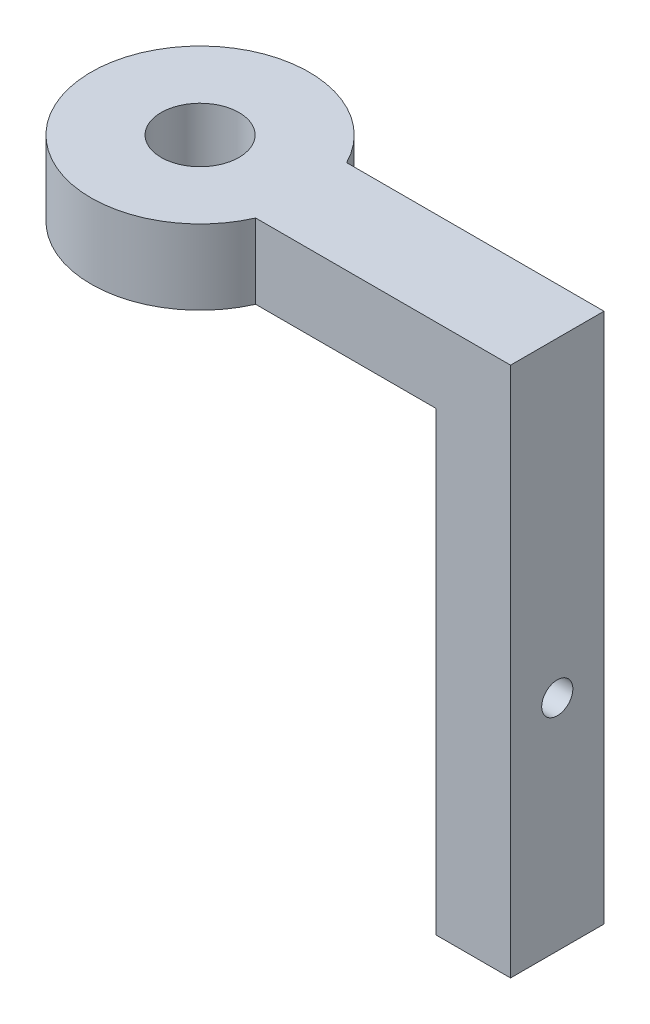
ISO-10303-21;
HEADER;
FILE_DESCRIPTION(('STEP AP214'),'2;1');
FILE_NAME('part.step','',(''),(''),'','','');
FILE_SCHEMA(('AUTOMOTIVE_DESIGN { 1 0 10303 214 1 1 1 1 }'));
ENDSEC;
DATA;
#1=APPLICATION_CONTEXT('core data for automotive mechanical design processes');
#2=APPLICATION_PROTOCOL_DEFINITION('international standard','automotive_design',2000,#1);
#3=PRODUCT_CONTEXT('',#1,'mechanical');
#4=PRODUCT('Part','Part','',(#3));
#5=PRODUCT_RELATED_PRODUCT_CATEGORY('part','',(#4));
#6=PRODUCT_DEFINITION_FORMATION('','',#4);
#7=PRODUCT_DEFINITION_CONTEXT('part definition',#1,'design');
#8=PRODUCT_DEFINITION('design','',#6,#7);
#9=PRODUCT_DEFINITION_SHAPE('','',#8);
#10=(LENGTH_UNIT() NAMED_UNIT(*) SI_UNIT(.MILLI.,.METRE.));
#11=(NAMED_UNIT(*) PLANE_ANGLE_UNIT() SI_UNIT($,.RADIAN.));
#12=(NAMED_UNIT(*) SI_UNIT($,.STERADIAN.) SOLID_ANGLE_UNIT());
#13=UNCERTAINTY_MEASURE_WITH_UNIT(LENGTH_MEASURE(1.E-05),#10,'distance_accuracy_value','');
#14=(GEOMETRIC_REPRESENTATION_CONTEXT(3) GLOBAL_UNCERTAINTY_ASSIGNED_CONTEXT((#13)) GLOBAL_UNIT_ASSIGNED_CONTEXT((#10,
#11,#12)) REPRESENTATION_CONTEXT('',''));
#15=CARTESIAN_POINT('',(0.,0.,0.));
#16=DIRECTION('',(0.,0.,1.));
#17=DIRECTION('',(1.,0.,0.));
#18=AXIS2_PLACEMENT_3D('',#15,#16,#17);
#19=CARTESIAN_POINT('',(-46.1534404276847,37.9375,15.));
#20=DIRECTION('',(0.,1.,0.));
#21=DIRECTION('',(0.,0.,1.));
#22=AXIS2_PLACEMENT_3D('',#19,#20,#21);
#23=PLANE('',#22);
#24=CARTESIAN_POINT('',(-58.0803469959912,37.9375,7.9203315090152));
#25=DIRECTION('',(0.,1.,0.));
#26=DIRECTION('',(0.,0.,1.));
#27=AXIS2_PLACEMENT_3D('',#24,#25,#26);
#28=CIRCLE('',#27,6.25);
#29=CARTESIAN_POINT('',(-58.0803469959912,37.9375,14.1703315090152));
#30=VERTEX_POINT('',#29);
#31=EDGE_CURVE('E112',#30,#30,#28,.T.);
#32=ORIENTED_EDGE('',*,*,#31,.T.);
#33=EDGE_LOOP('',(#32));
#34=FACE_BOUND('',#33,.T.);
#35=DIRECTION('',(1.,0.,0.));
#36=VECTOR('',#35,1.);
#37=CARTESIAN_POINT('',(-46.1534404276847,37.9375,15.));
#38=LINE('',#37,#36);
#39=CARTESIAN_POINT('',(-42.0763383088604,37.9375,15.));
#40=VERTEX_POINT('',#39);
#41=CARTESIAN_POINT('',(-13.1534404276847,37.9375,15.));
#42=VERTEX_POINT('',#41);
#43=EDGE_CURVE('E84',#40,#42,#38,.T.);
#44=ORIENTED_EDGE('',*,*,#43,.F.);
#45=CARTESIAN_POINT('',(-58.0803469959912,37.9375,7.9203315090152));
#46=DIRECTION('',(0.,1.,0.));
#47=DIRECTION('',(0.,0.,1.));
#48=AXIS2_PLACEMENT_3D('',#45,#46,#47);
#49=CIRCLE('',#48,17.5);
#50=CARTESIAN_POINT('',(-42.4752725396709,37.9375,0.));
#51=VERTEX_POINT('',#50);
#52=EDGE_CURVE('E103',#51,#40,#49,.T.);
#53=ORIENTED_EDGE('',*,*,#52,.F.);
#54=DIRECTION('',(1.,0.,0.));
#55=VECTOR('',#54,1.);
#56=CARTESIAN_POINT('',(-46.1534404276847,37.9375,0.));
#57=LINE('',#56,#55);
#58=CARTESIAN_POINT('',(-13.1534404276847,37.9375,0.));
#59=VERTEX_POINT('',#58);
#60=EDGE_CURVE('E104',#51,#59,#57,.T.);
#61=ORIENTED_EDGE('',*,*,#60,.T.);
#62=DIRECTION('',(0.,0.,-1.));
#63=VECTOR('',#62,1.);
#64=CARTESIAN_POINT('',(-13.1534404276847,37.9375,15.));
#65=LINE('',#64,#63);
#66=EDGE_CURVE('E47',#42,#59,#65,.T.);
#67=ORIENTED_EDGE('',*,*,#66,.F.);
#68=EDGE_LOOP('',(#44,#53,#61,#67));
#69=FACE_BOUND('',#68,.T.);
#70=ADVANCED_FACE('F39',(#34,#69),#23,.F.);
#71=CARTESIAN_POINT('',(-13.1534404276847,37.9375,15.));
#72=DIRECTION('',(1.,0.,0.));
#73=DIRECTION('',(0.,1.,0.));
#74=AXIS2_PLACEMENT_3D('',#71,#72,#73);
#75=PLANE('',#74);
#76=CARTESIAN_POINT('',(-13.1534404276847,-0.0625000000000015,7.5));
#77=DIRECTION('',(1.,0.,0.));
#78=DIRECTION('',(0.,1.,0.));
#79=AXIS2_PLACEMENT_3D('',#76,#77,#78);
#80=CIRCLE('',#79,2.5);
#81=CARTESIAN_POINT('',(-13.1534404276847,2.4375,7.5));
#82=VERTEX_POINT('',#81);
#83=EDGE_CURVE('E146',#82,#82,#80,.T.);
#84=ORIENTED_EDGE('',*,*,#83,.T.);
#85=EDGE_LOOP('',(#84));
#86=FACE_BOUND('',#85,.T.);
#87=DIRECTION('',(0.,-1.,0.));
#88=VECTOR('',#87,1.);
#89=CARTESIAN_POINT('',(-13.1534404276847,37.9375,0.));
#90=LINE('',#89,#88);
#91=CARTESIAN_POINT('',(-13.1534404276847,-35.2743804561542,0.));
#92=VERTEX_POINT('',#91);
#93=EDGE_CURVE('E125',#59,#92,#90,.T.);
#94=ORIENTED_EDGE('',*,*,#93,.T.);
#95=DIRECTION('',(0.,0.,-1.));
#96=VECTOR('',#95,1.);
#97=CARTESIAN_POINT('',(-13.1534404276847,-35.2743804561542,15.));
#98=LINE('',#97,#96);
#99=CARTESIAN_POINT('',(-13.1534404276847,-35.2743804561542,15.));
#100=VERTEX_POINT('',#99);
#101=EDGE_CURVE('E191',#100,#92,#98,.T.);
#102=ORIENTED_EDGE('',*,*,#101,.F.);
#103=DIRECTION('',(0.,-1.,0.));
#104=VECTOR('',#103,1.);
#105=CARTESIAN_POINT('',(-13.1534404276847,37.9375,15.));
#106=LINE('',#105,#104);
#107=EDGE_CURVE('E136',#42,#100,#106,.T.);
#108=ORIENTED_EDGE('',*,*,#107,.F.);
#109=ORIENTED_EDGE('',*,*,#66,.T.);
#110=EDGE_LOOP('',(#94,#102,#108,#109));
#111=FACE_BOUND('',#110,.T.);
#112=ADVANCED_FACE('F175',(#86,#111),#75,.F.);
#113=CARTESIAN_POINT('',(-13.1534404276847,-35.2743804561542,15.));
#114=DIRECTION('',(0.,1.,0.));
#115=DIRECTION('',(0.,0.,1.));
#116=AXIS2_PLACEMENT_3D('',#113,#114,#115);
#117=PLANE('',#116);
#118=DIRECTION('',(1.,0.,0.));
#119=VECTOR('',#118,1.);
#120=CARTESIAN_POINT('',(-13.1534404276847,-35.2743804561542,0.));
#121=LINE('',#120,#119);
#122=CARTESIAN_POINT('',(-1.15344042768469,-35.2743804561542,0.));
#123=VERTEX_POINT('',#122);
#124=EDGE_CURVE('E196',#92,#123,#121,.T.);
#125=ORIENTED_EDGE('',*,*,#124,.T.);
#126=DIRECTION('',(0.,0.,-1.));
#127=VECTOR('',#126,1.);
#128=CARTESIAN_POINT('',(-1.15344042768469,-35.2743804561542,15.));
#129=LINE('',#128,#127);
#130=CARTESIAN_POINT('',(-1.15344042768469,-35.2743804561542,15.));
#131=VERTEX_POINT('',#130);
#132=EDGE_CURVE('E117',#131,#123,#129,.T.);
#133=ORIENTED_EDGE('',*,*,#132,.F.);
#134=DIRECTION('',(1.,0.,0.));
#135=VECTOR('',#134,1.);
#136=CARTESIAN_POINT('',(-13.1534404276847,-35.2743804561542,15.));
#137=LINE('',#136,#135);
#138=EDGE_CURVE('E119',#100,#131,#137,.T.);
#139=ORIENTED_EDGE('',*,*,#138,.F.);
#140=ORIENTED_EDGE('',*,*,#101,.T.);
#141=EDGE_LOOP('',(#125,#133,#139,#140));
#142=FACE_BOUND('',#141,.T.);
#143=ADVANCED_FACE('F165',(#142),#117,.F.);
#144=CARTESIAN_POINT('',(-1.15344042768471,49.9375,15.));
#145=DIRECTION('',(-1.,0.,0.));
#146=DIRECTION('',(0.,-1.,0.));
#147=AXIS2_PLACEMENT_3D('',#144,#145,#146);
#148=PLANE('',#147);
#149=CARTESIAN_POINT('',(-1.1534404276847,-0.0625000000000002,7.5));
#150=DIRECTION('',(1.,0.,0.));
#151=DIRECTION('',(0.,1.,0.));
#152=AXIS2_PLACEMENT_3D('',#149,#150,#151);
#153=CIRCLE('',#152,2.5);
#154=CARTESIAN_POINT('',(-1.1534404276847,2.4375,7.5));
#155=VERTEX_POINT('',#154);
#156=EDGE_CURVE('E154',#155,#155,#153,.T.);
#157=ORIENTED_EDGE('',*,*,#156,.F.);
#158=EDGE_LOOP('',(#157));
#159=FACE_BOUND('',#158,.T.);
#160=DIRECTION('',(0.,1.,0.));
#161=VECTOR('',#160,1.);
#162=CARTESIAN_POINT('',(-1.15344042768471,49.9375,0.));
#163=LINE('',#162,#161);
#164=CARTESIAN_POINT('',(-1.15344042768471,49.9375,0.));
#165=VERTEX_POINT('',#164);
#166=EDGE_CURVE('E73',#123,#165,#163,.T.);
#167=ORIENTED_EDGE('',*,*,#166,.T.);
#168=DIRECTION('',(0.,0.,-1.));
#169=VECTOR('',#168,1.);
#170=CARTESIAN_POINT('',(-1.15344042768471,49.9375,15.));
#171=LINE('',#170,#169);
#172=CARTESIAN_POINT('',(-1.15344042768471,49.9375,15.));
#173=VERTEX_POINT('',#172);
#174=EDGE_CURVE('E115',#173,#165,#171,.T.);
#175=ORIENTED_EDGE('',*,*,#174,.F.);
#176=DIRECTION('',(0.,1.,0.));
#177=VECTOR('',#176,1.);
#178=CARTESIAN_POINT('',(-1.1534404276847,37.9375,15.));
#179=LINE('',#178,#177);
#180=EDGE_CURVE('E55',#131,#173,#179,.T.);
#181=ORIENTED_EDGE('',*,*,#180,.F.);
#182=ORIENTED_EDGE('',*,*,#132,.T.);
#183=EDGE_LOOP('',(#167,#175,#181,#182));
#184=FACE_BOUND('',#183,.T.);
#185=ADVANCED_FACE('F163',(#159,#184),#148,.F.);
#186=CARTESIAN_POINT('',(-46.1534404276847,49.9375,15.));
#187=DIRECTION('',(0.,-1.,0.));
#188=DIRECTION('',(0.,0.,-1.));
#189=AXIS2_PLACEMENT_3D('',#186,#187,#188);
#190=PLANE('',#189);
#191=CARTESIAN_POINT('',(-58.0803469959912,49.9375,7.9203315090152));
#192=DIRECTION('',(0.,1.,0.));
#193=DIRECTION('',(0.,0.,1.));
#194=AXIS2_PLACEMENT_3D('',#191,#192,#193);
#195=CIRCLE('',#194,6.25);
#196=CARTESIAN_POINT('',(-58.0803469959912,49.9375,14.1703315090152));
#197=VERTEX_POINT('',#196);
#198=EDGE_CURVE('E145',#197,#197,#195,.T.);
#199=ORIENTED_EDGE('',*,*,#198,.F.);
#200=EDGE_LOOP('',(#199));
#201=FACE_BOUND('',#200,.T.);
#202=DIRECTION('',(-1.,0.,0.));
#203=VECTOR('',#202,1.);
#204=CARTESIAN_POINT('',(-46.1534404276847,49.9375,0.));
#205=LINE('',#204,#203);
#206=CARTESIAN_POINT('',(-42.4752725396709,49.9375,0.));
#207=VERTEX_POINT('',#206);
#208=EDGE_CURVE('E111',#165,#207,#205,.T.);
#209=ORIENTED_EDGE('',*,*,#208,.T.);
#210=CARTESIAN_POINT('',(-58.0803469959912,49.9375,7.9203315090152));
#211=DIRECTION('',(0.,1.,0.));
#212=DIRECTION('',(0.,0.,1.));
#213=AXIS2_PLACEMENT_3D('',#210,#211,#212);
#214=CIRCLE('',#213,17.5);
#215=CARTESIAN_POINT('',(-42.0763383088604,49.9375,15.));
#216=VERTEX_POINT('',#215);
#217=EDGE_CURVE('E101',#207,#216,#214,.T.);
#218=ORIENTED_EDGE('',*,*,#217,.T.);
#219=DIRECTION('',(-1.,0.,0.));
#220=VECTOR('',#219,1.);
#221=CARTESIAN_POINT('',(-46.1534404276847,49.9375,15.));
#222=LINE('',#221,#220);
#223=EDGE_CURVE('E110',#173,#216,#222,.T.);
#224=ORIENTED_EDGE('',*,*,#223,.F.);
#225=ORIENTED_EDGE('',*,*,#174,.T.);
#226=EDGE_LOOP('',(#209,#218,#224,#225));
#227=FACE_BOUND('',#226,.T.);
#228=ADVANCED_FACE('F109',(#201,#227),#190,.F.);
#229=CARTESIAN_POINT('',(0.,0.,15.));
#230=DIRECTION('',(0.,0.,1.));
#231=DIRECTION('',(1.,0.,0.));
#232=AXIS2_PLACEMENT_3D('',#229,#230,#231);
#233=PLANE('',#232);
#234=DIRECTION('',(0.,1.,0.));
#235=VECTOR('',#234,1.);
#236=CARTESIAN_POINT('',(-42.0763383088604,37.9375,15.));
#237=LINE('',#236,#235);
#238=EDGE_CURVE('E98',#40,#216,#237,.T.);
#239=ORIENTED_EDGE('',*,*,#238,.F.);
#240=ORIENTED_EDGE('',*,*,#43,.T.);
#241=ORIENTED_EDGE('',*,*,#107,.T.);
#242=ORIENTED_EDGE('',*,*,#138,.T.);
#243=ORIENTED_EDGE('',*,*,#180,.T.);
#244=ORIENTED_EDGE('',*,*,#223,.T.);
#245=EDGE_LOOP('',(#239,#240,#241,#242,#243,#244));
#246=FACE_BOUND('',#245,.T.);
#247=ADVANCED_FACE('F114',(#246),#233,.T.);
#248=CARTESIAN_POINT('',(0.,0.,0.));
#249=DIRECTION('',(0.,0.,1.));
#250=DIRECTION('',(1.,0.,0.));
#251=AXIS2_PLACEMENT_3D('',#248,#249,#250);
#252=PLANE('',#251);
#253=ORIENTED_EDGE('',*,*,#60,.F.);
#254=DIRECTION('',(0.,1.,0.));
#255=VECTOR('',#254,1.);
#256=CARTESIAN_POINT('',(-42.4752725396709,37.9375,0.));
#257=LINE('',#256,#255);
#258=EDGE_CURVE('E12',#51,#207,#257,.T.);
#259=ORIENTED_EDGE('',*,*,#258,.T.);
#260=ORIENTED_EDGE('',*,*,#208,.F.);
#261=ORIENTED_EDGE('',*,*,#166,.F.);
#262=ORIENTED_EDGE('',*,*,#124,.F.);
#263=ORIENTED_EDGE('',*,*,#93,.F.);
#264=EDGE_LOOP('',(#253,#259,#260,#261,#262,#263));
#265=FACE_BOUND('',#264,.T.);
#266=ADVANCED_FACE('F198',(#265),#252,.F.);
#267=CARTESIAN_POINT('',(-58.0803469959912,37.9375,7.9203315090152));
#268=DIRECTION('',(0.,1.,0.));
#269=DIRECTION('',(0.,0.,1.));
#270=AXIS2_PLACEMENT_3D('',#267,#268,#269);
#271=CYLINDRICAL_SURFACE('',#270,17.5);
#272=ORIENTED_EDGE('',*,*,#52,.T.);
#273=ORIENTED_EDGE('',*,*,#238,.T.);
#274=ORIENTED_EDGE('',*,*,#217,.F.);
#275=ORIENTED_EDGE('',*,*,#258,.F.);
#276=EDGE_LOOP('',(#272,#273,#274,#275));
#277=FACE_BOUND('',#276,.T.);
#278=ADVANCED_FACE('F100',(#277),#271,.T.);
#279=CARTESIAN_POINT('',(-58.0803469959912,37.9375,7.9203315090152));
#280=DIRECTION('',(0.,1.,0.));
#281=DIRECTION('',(0.,0.,1.));
#282=AXIS2_PLACEMENT_3D('',#279,#280,#281);
#283=CYLINDRICAL_SURFACE('',#282,6.25);
#284=ORIENTED_EDGE('',*,*,#31,.F.);
#285=EDGE_LOOP('',(#284));
#286=FACE_BOUND('',#285,.T.);
#287=ORIENTED_EDGE('',*,*,#198,.T.);
#288=EDGE_LOOP('',(#287));
#289=FACE_BOUND('',#288,.T.);
#290=ADVANCED_FACE('F210',(#286,#289),#283,.F.);
#291=CARTESIAN_POINT('',(-75.5803469959912,-0.0625000000000082,7.5));
#292=DIRECTION('',(1.,0.,0.));
#293=DIRECTION('',(0.,1.,0.));
#294=AXIS2_PLACEMENT_3D('',#291,#292,#293);
#295=CYLINDRICAL_SURFACE('',#294,2.5);
#296=ORIENTED_EDGE('',*,*,#156,.T.);
#297=EDGE_LOOP('',(#296));
#298=FACE_BOUND('',#297,.T.);
#299=ORIENTED_EDGE('',*,*,#83,.F.);
#300=EDGE_LOOP('',(#299));
#301=FACE_BOUND('',#300,.T.);
#302=ADVANCED_FACE('F160',(#298,#301),#295,.F.);
#303=CLOSED_SHELL('',(#70,#112,#143,#185,#228,#247,#266,#278,#290,#302));
#304=MANIFOLD_SOLID_BREP('B2',#303);
#305=ADVANCED_BREP_SHAPE_REPRESENTATION('',(#18,#304),#14);
#306=SHAPE_DEFINITION_REPRESENTATION(#9,#305);
ENDSEC;
END-ISO-10303-21;
